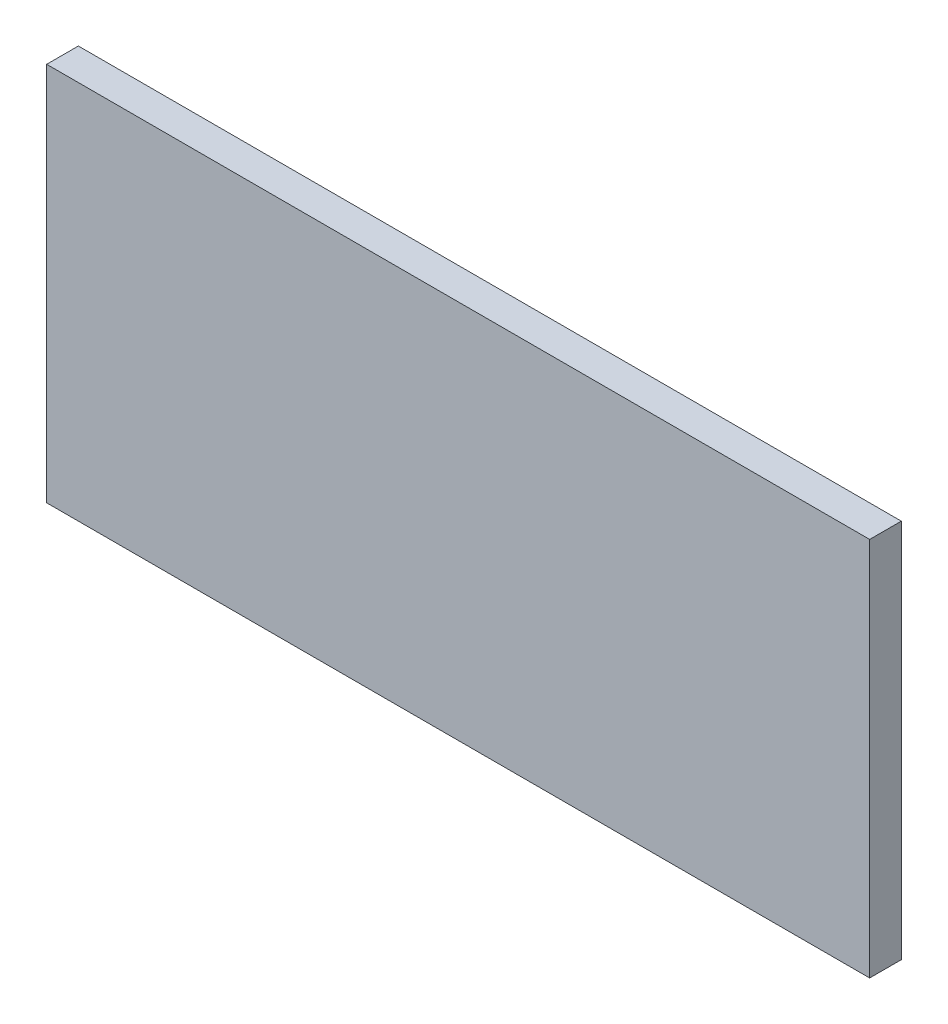
ISO-10303-21;
HEADER;
FILE_DESCRIPTION(('STEP AP214'),'2;1');
FILE_NAME('part.step','',(''),(''),'','','');
FILE_SCHEMA(('AUTOMOTIVE_DESIGN { 1 0 10303 214 1 1 1 1 }'));
ENDSEC;
DATA;
#1=APPLICATION_CONTEXT('core data for automotive mechanical design processes');
#2=APPLICATION_PROTOCOL_DEFINITION('international standard','automotive_design',2000,#1);
#3=PRODUCT_CONTEXT('',#1,'mechanical');
#4=PRODUCT('Part','Part','',(#3));
#5=PRODUCT_RELATED_PRODUCT_CATEGORY('part','',(#4));
#6=PRODUCT_DEFINITION_FORMATION('','',#4);
#7=PRODUCT_DEFINITION_CONTEXT('part definition',#1,'design');
#8=PRODUCT_DEFINITION('design','',#6,#7);
#9=PRODUCT_DEFINITION_SHAPE('','',#8);
#10=(LENGTH_UNIT() NAMED_UNIT(*) SI_UNIT(.MILLI.,.METRE.));
#11=(NAMED_UNIT(*) PLANE_ANGLE_UNIT() SI_UNIT($,.RADIAN.));
#12=(NAMED_UNIT(*) SI_UNIT($,.STERADIAN.) SOLID_ANGLE_UNIT());
#13=UNCERTAINTY_MEASURE_WITH_UNIT(LENGTH_MEASURE(1.E-05),#10,'distance_accuracy_value','');
#14=(GEOMETRIC_REPRESENTATION_CONTEXT(3) GLOBAL_UNCERTAINTY_ASSIGNED_CONTEXT((#13)) GLOBAL_UNIT_ASSIGNED_CONTEXT((#10,
#11,#12)) REPRESENTATION_CONTEXT('',''));
#15=CARTESIAN_POINT('',(0.,0.,0.));
#16=DIRECTION('',(0.,0.,1.));
#17=DIRECTION('',(1.,0.,0.));
#18=AXIS2_PLACEMENT_3D('',#15,#16,#17);
#19=CARTESIAN_POINT('',(41.275,-19.05,3.175));
#20=DIRECTION('',(-1.,0.,0.));
#21=DIRECTION('',(0.,0.,1.));
#22=AXIS2_PLACEMENT_3D('',#19,#20,#21);
#23=PLANE('',#22);
#24=DIRECTION('',(0.,1.,0.));
#25=VECTOR('',#24,1.);
#26=CARTESIAN_POINT('',(41.275,-19.05,0.));
#27=LINE('',#26,#25);
#28=CARTESIAN_POINT('',(41.275,-19.05,0.));
#29=VERTEX_POINT('',#28);
#30=CARTESIAN_POINT('',(41.275,19.05,0.));
#31=VERTEX_POINT('',#30);
#32=EDGE_CURVE('E97',#29,#31,#27,.T.);
#33=ORIENTED_EDGE('',*,*,#32,.T.);
#34=DIRECTION('',(0.,0.,-1.));
#35=VECTOR('',#34,1.);
#36=CARTESIAN_POINT('',(41.275,19.05,3.175));
#37=LINE('',#36,#35);
#38=CARTESIAN_POINT('',(41.275,19.05,3.175));
#39=VERTEX_POINT('',#38);
#40=EDGE_CURVE('E11',#39,#31,#37,.T.);
#41=ORIENTED_EDGE('',*,*,#40,.F.);
#42=DIRECTION('',(0.,1.,0.));
#43=VECTOR('',#42,1.);
#44=CARTESIAN_POINT('',(41.275,-19.05,3.175));
#45=LINE('',#44,#43);
#46=CARTESIAN_POINT('',(41.275,-19.05,3.175));
#47=VERTEX_POINT('',#46);
#48=EDGE_CURVE('E85',#47,#39,#45,.T.);
#49=ORIENTED_EDGE('',*,*,#48,.F.);
#50=DIRECTION('',(0.,0.,-1.));
#51=VECTOR('',#50,1.);
#52=CARTESIAN_POINT('',(41.275,-19.05,3.175));
#53=LINE('',#52,#51);
#54=EDGE_CURVE('E93',#47,#29,#53,.T.);
#55=ORIENTED_EDGE('',*,*,#54,.T.);
#56=EDGE_LOOP('',(#33,#41,#49,#55));
#57=FACE_BOUND('',#56,.T.);
#58=ADVANCED_FACE('F34',(#57),#23,.F.);
#59=CARTESIAN_POINT('',(-41.275,19.05,3.175));
#60=DIRECTION('',(0.,-1.,0.));
#61=DIRECTION('',(0.,0.,-1.));
#62=AXIS2_PLACEMENT_3D('',#59,#60,#61);
#63=PLANE('',#62);
#64=DIRECTION('',(-1.,0.,0.));
#65=VECTOR('',#64,1.);
#66=CARTESIAN_POINT('',(-41.275,19.05,0.));
#67=LINE('',#66,#65);
#68=CARTESIAN_POINT('',(-41.275,19.05,0.));
#69=VERTEX_POINT('',#68);
#70=EDGE_CURVE('E89',#31,#69,#67,.T.);
#71=ORIENTED_EDGE('',*,*,#70,.T.);
#72=DIRECTION('',(0.,0.,-1.));
#73=VECTOR('',#72,1.);
#74=CARTESIAN_POINT('',(-41.275,19.05,3.175));
#75=LINE('',#74,#73);
#76=CARTESIAN_POINT('',(-41.275,19.05,3.175));
#77=VERTEX_POINT('',#76);
#78=EDGE_CURVE('E42',#77,#69,#75,.T.);
#79=ORIENTED_EDGE('',*,*,#78,.F.);
#80=DIRECTION('',(-1.,0.,0.));
#81=VECTOR('',#80,1.);
#82=CARTESIAN_POINT('',(-41.275,19.05,3.175));
#83=LINE('',#82,#81);
#84=EDGE_CURVE('E80',#39,#77,#83,.T.);
#85=ORIENTED_EDGE('',*,*,#84,.F.);
#86=ORIENTED_EDGE('',*,*,#40,.T.);
#87=EDGE_LOOP('',(#71,#79,#85,#86));
#88=FACE_BOUND('',#87,.T.);
#89=ADVANCED_FACE('F88',(#88),#63,.F.);
#90=CARTESIAN_POINT('',(-41.275,-19.05,3.175));
#91=DIRECTION('',(1.,0.,0.));
#92=DIRECTION('',(0.,0.,-1.));
#93=AXIS2_PLACEMENT_3D('',#90,#91,#92);
#94=PLANE('',#93);
#95=DIRECTION('',(0.,-1.,0.));
#96=VECTOR('',#95,1.);
#97=CARTESIAN_POINT('',(-41.275,-19.05,0.));
#98=LINE('',#97,#96);
#99=CARTESIAN_POINT('',(-41.275,-19.05,0.));
#100=VERTEX_POINT('',#99);
#101=EDGE_CURVE('E67',#69,#100,#98,.T.);
#102=ORIENTED_EDGE('',*,*,#101,.T.);
#103=DIRECTION('',(0.,0.,-1.));
#104=VECTOR('',#103,1.);
#105=CARTESIAN_POINT('',(-41.275,-19.05,3.175));
#106=LINE('',#105,#104);
#107=CARTESIAN_POINT('',(-41.275,-19.05,3.175));
#108=VERTEX_POINT('',#107);
#109=EDGE_CURVE('E90',#108,#100,#106,.T.);
#110=ORIENTED_EDGE('',*,*,#109,.F.);
#111=DIRECTION('',(0.,-1.,0.));
#112=VECTOR('',#111,1.);
#113=CARTESIAN_POINT('',(-41.275,-19.05,3.175));
#114=LINE('',#113,#112);
#115=EDGE_CURVE('E83',#77,#108,#114,.T.);
#116=ORIENTED_EDGE('',*,*,#115,.F.);
#117=ORIENTED_EDGE('',*,*,#78,.T.);
#118=EDGE_LOOP('',(#102,#110,#116,#117));
#119=FACE_BOUND('',#118,.T.);
#120=ADVANCED_FACE('F91',(#119),#94,.F.);
#121=CARTESIAN_POINT('',(-41.275,-19.05,3.175));
#122=DIRECTION('',(0.,1.,0.));
#123=DIRECTION('',(0.,0.,1.));
#124=AXIS2_PLACEMENT_3D('',#121,#122,#123);
#125=PLANE('',#124);
#126=DIRECTION('',(1.,0.,0.));
#127=VECTOR('',#126,1.);
#128=CARTESIAN_POINT('',(-41.275,-19.05,0.));
#129=LINE('',#128,#127);
#130=EDGE_CURVE('E73',#100,#29,#129,.T.);
#131=ORIENTED_EDGE('',*,*,#130,.T.);
#132=ORIENTED_EDGE('',*,*,#54,.F.);
#133=DIRECTION('',(1.,0.,0.));
#134=VECTOR('',#133,1.);
#135=CARTESIAN_POINT('',(-41.275,-19.05,3.175));
#136=LINE('',#135,#134);
#137=EDGE_CURVE('E50',#108,#47,#136,.T.);
#138=ORIENTED_EDGE('',*,*,#137,.F.);
#139=ORIENTED_EDGE('',*,*,#109,.T.);
#140=EDGE_LOOP('',(#131,#132,#138,#139));
#141=FACE_BOUND('',#140,.T.);
#142=ADVANCED_FACE('F104',(#141),#125,.F.);
#143=CARTESIAN_POINT('',(0.,0.,3.175));
#144=DIRECTION('',(0.,0.,-1.));
#145=DIRECTION('',(-1.,0.,0.));
#146=AXIS2_PLACEMENT_3D('',#143,#144,#145);
#147=PLANE('',#146);
#148=ORIENTED_EDGE('',*,*,#48,.T.);
#149=ORIENTED_EDGE('',*,*,#84,.T.);
#150=ORIENTED_EDGE('',*,*,#115,.T.);
#151=ORIENTED_EDGE('',*,*,#137,.T.);
#152=EDGE_LOOP('',(#148,#149,#150,#151));
#153=FACE_BOUND('',#152,.T.);
#154=ADVANCED_FACE('F81',(#153),#147,.F.);
#155=CARTESIAN_POINT('',(0.,0.,0.));
#156=DIRECTION('',(0.,0.,-1.));
#157=DIRECTION('',(-1.,0.,0.));
#158=AXIS2_PLACEMENT_3D('',#155,#156,#157);
#159=PLANE('',#158);
#160=ORIENTED_EDGE('',*,*,#32,.F.);
#161=ORIENTED_EDGE('',*,*,#130,.F.);
#162=ORIENTED_EDGE('',*,*,#101,.F.);
#163=ORIENTED_EDGE('',*,*,#70,.F.);
#164=EDGE_LOOP('',(#160,#161,#162,#163));
#165=FACE_BOUND('',#164,.T.);
#166=ADVANCED_FACE('F107',(#165),#159,.T.);
#167=CLOSED_SHELL('',(#58,#89,#120,#142,#154,#166));
#168=MANIFOLD_SOLID_BREP('B2',#167);
#169=ADVANCED_BREP_SHAPE_REPRESENTATION('',(#18,#168),#14);
#170=SHAPE_DEFINITION_REPRESENTATION(#9,#169);
ENDSEC;
END-ISO-10303-21;
